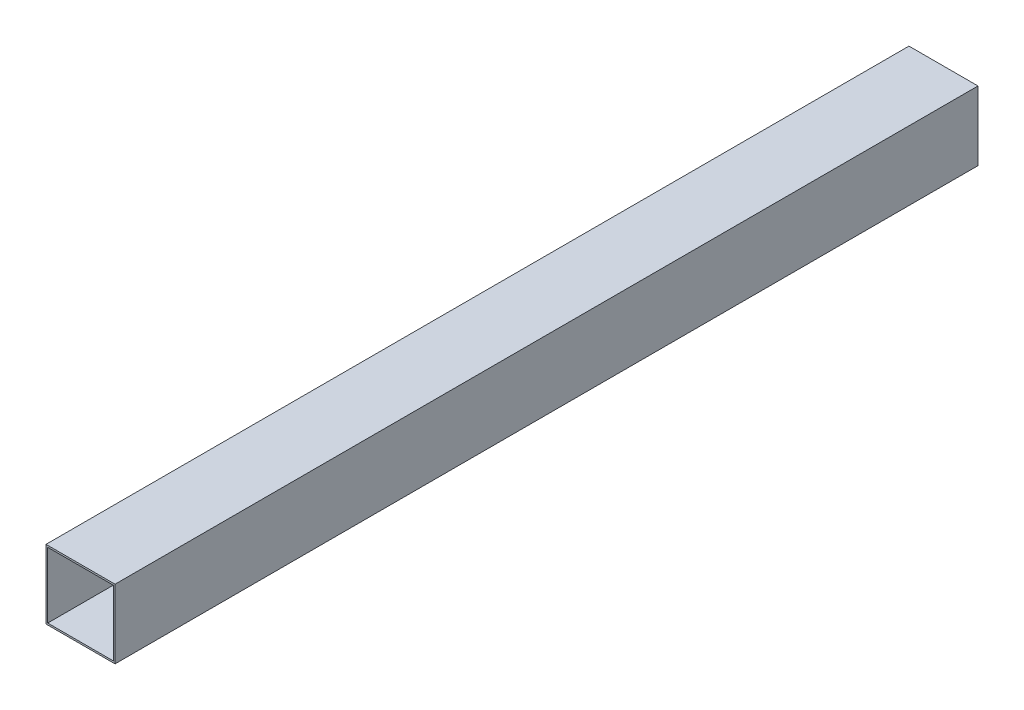
ISO-10303-21;
HEADER;
FILE_DESCRIPTION(('STEP AP214'),'2;1');
FILE_NAME('part.step','',(''),(''),'','','');
FILE_SCHEMA(('AUTOMOTIVE_DESIGN { 1 0 10303 214 1 1 1 1 }'));
ENDSEC;
DATA;
#1=APPLICATION_CONTEXT('core data for automotive mechanical design processes');
#2=APPLICATION_PROTOCOL_DEFINITION('international standard','automotive_design',2000,#1);
#3=PRODUCT_CONTEXT('',#1,'mechanical');
#4=PRODUCT('Part','Part','',(#3));
#5=PRODUCT_RELATED_PRODUCT_CATEGORY('part','',(#4));
#6=PRODUCT_DEFINITION_FORMATION('','',#4);
#7=PRODUCT_DEFINITION_CONTEXT('part definition',#1,'design');
#8=PRODUCT_DEFINITION('design','',#6,#7);
#9=PRODUCT_DEFINITION_SHAPE('','',#8);
#10=(LENGTH_UNIT() NAMED_UNIT(*) SI_UNIT(.MILLI.,.METRE.));
#11=(NAMED_UNIT(*) PLANE_ANGLE_UNIT() SI_UNIT($,.RADIAN.));
#12=(NAMED_UNIT(*) SI_UNIT($,.STERADIAN.) SOLID_ANGLE_UNIT());
#13=UNCERTAINTY_MEASURE_WITH_UNIT(LENGTH_MEASURE(1.E-05),#10,'distance_accuracy_value','');
#14=(GEOMETRIC_REPRESENTATION_CONTEXT(3) GLOBAL_UNCERTAINTY_ASSIGNED_CONTEXT((#13)) GLOBAL_UNIT_ASSIGNED_CONTEXT((#10,
#11,#12)) REPRESENTATION_CONTEXT('',''));
#15=CARTESIAN_POINT('',(0.,0.,0.));
#16=DIRECTION('',(0.,0.,1.));
#17=DIRECTION('',(1.,0.,0.));
#18=AXIS2_PLACEMENT_3D('',#15,#16,#17);
#19=CARTESIAN_POINT('',(0.,0.,500.));
#20=DIRECTION('',(0.,0.,1.));
#21=DIRECTION('',(1.,0.,0.));
#22=AXIS2_PLACEMENT_3D('',#19,#20,#21);
#23=PLANE('',#22);
#24=DIRECTION('',(0.,-1.,0.));
#25=VECTOR('',#24,1.);
#26=CARTESIAN_POINT('',(0.,29.5228896041213,500.));
#27=LINE('',#26,#25);
#28=CARTESIAN_POINT('',(0.,29.5228896041213,500.));
#29=VERTEX_POINT('',#28);
#30=CARTESIAN_POINT('',(0.,-10.4771103958787,500.));
#31=VERTEX_POINT('',#30);
#32=EDGE_CURVE('E142',#29,#31,#27,.T.);
#33=ORIENTED_EDGE('',*,*,#32,.T.);
#34=DIRECTION('',(1.,0.,0.));
#35=VECTOR('',#34,1.);
#36=CARTESIAN_POINT('',(0.,-10.4771103958787,500.));
#37=LINE('',#36,#35);
#38=CARTESIAN_POINT('',(40.,-10.4771103958787,500.));
#39=VERTEX_POINT('',#38);
#40=EDGE_CURVE('E145',#31,#39,#37,.T.);
#41=ORIENTED_EDGE('',*,*,#40,.T.);
#42=DIRECTION('',(0.,1.,0.));
#43=VECTOR('',#42,1.);
#44=CARTESIAN_POINT('',(40.,29.5228896041213,500.));
#45=LINE('',#44,#43);
#46=CARTESIAN_POINT('',(40.,29.5228896041213,500.));
#47=VERTEX_POINT('',#46);
#48=EDGE_CURVE('E148',#39,#47,#45,.T.);
#49=ORIENTED_EDGE('',*,*,#48,.T.);
#50=DIRECTION('',(-1.,0.,0.));
#51=VECTOR('',#50,1.);
#52=CARTESIAN_POINT('',(0.,29.5228896041213,500.));
#53=LINE('',#52,#51);
#54=EDGE_CURVE('E150',#47,#29,#53,.T.);
#55=ORIENTED_EDGE('',*,*,#54,.T.);
#56=EDGE_LOOP('',(#33,#41,#49,#55));
#57=FACE_BOUND('',#56,.T.);
#58=DIRECTION('',(1.,0.,0.));
#59=VECTOR('',#58,1.);
#60=CARTESIAN_POINT('',(1.,-9.4771103958787,500.));
#61=LINE('',#60,#59);
#62=CARTESIAN_POINT('',(1.,-9.4771103958787,500.));
#63=VERTEX_POINT('',#62);
#64=CARTESIAN_POINT('',(39.,-9.4771103958787,500.));
#65=VERTEX_POINT('',#64);
#66=EDGE_CURVE('E114',#63,#65,#61,.T.);
#67=ORIENTED_EDGE('',*,*,#66,.F.);
#68=DIRECTION('',(0.,-1.,0.));
#69=VECTOR('',#68,1.);
#70=CARTESIAN_POINT('',(0.999999999999997,28.5228896041213,500.));
#71=LINE('',#70,#69);
#72=CARTESIAN_POINT('',(0.999999999999997,28.5228896041213,500.));
#73=VERTEX_POINT('',#72);
#74=EDGE_CURVE('E106',#73,#63,#71,.T.);
#75=ORIENTED_EDGE('',*,*,#74,.F.);
#76=DIRECTION('',(-1.,0.,0.));
#77=VECTOR('',#76,1.);
#78=CARTESIAN_POINT('',(0.999999999999997,28.5228896041213,500.));
#79=LINE('',#78,#77);
#80=CARTESIAN_POINT('',(39.,28.5228896041213,500.));
#81=VERTEX_POINT('',#80);
#82=EDGE_CURVE('E128',#81,#73,#79,.T.);
#83=ORIENTED_EDGE('',*,*,#82,.F.);
#84=DIRECTION('',(0.,1.,0.));
#85=VECTOR('',#84,1.);
#86=CARTESIAN_POINT('',(39.,28.5228896041213,500.));
#87=LINE('',#86,#85);
#88=EDGE_CURVE('E126',#65,#81,#87,.T.);
#89=ORIENTED_EDGE('',*,*,#88,.F.);
#90=EDGE_LOOP('',(#67,#75,#83,#89));
#91=FACE_BOUND('',#90,.T.);
#92=ADVANCED_FACE('F41',(#57,#91),#23,.T.);
#93=CARTESIAN_POINT('',(0.,0.,0.));
#94=DIRECTION('',(0.,0.,1.));
#95=DIRECTION('',(1.,0.,0.));
#96=AXIS2_PLACEMENT_3D('',#93,#94,#95);
#97=PLANE('',#96);
#98=DIRECTION('',(0.,-1.,0.));
#99=VECTOR('',#98,1.);
#100=CARTESIAN_POINT('',(0.,29.5228896041213,0.));
#101=LINE('',#100,#99);
#102=CARTESIAN_POINT('',(0.,29.5228896041213,0.));
#103=VERTEX_POINT('',#102);
#104=CARTESIAN_POINT('',(0.,-10.4771103958787,0.));
#105=VERTEX_POINT('',#104);
#106=EDGE_CURVE('E122',#103,#105,#101,.T.);
#107=ORIENTED_EDGE('',*,*,#106,.F.);
#108=DIRECTION('',(-1.,0.,0.));
#109=VECTOR('',#108,1.);
#110=CARTESIAN_POINT('',(0.,29.5228896041213,0.));
#111=LINE('',#110,#109);
#112=CARTESIAN_POINT('',(40.,29.5228896041213,0.));
#113=VERTEX_POINT('',#112);
#114=EDGE_CURVE('E146',#113,#103,#111,.T.);
#115=ORIENTED_EDGE('',*,*,#114,.F.);
#116=DIRECTION('',(0.,1.,0.));
#117=VECTOR('',#116,1.);
#118=CARTESIAN_POINT('',(40.,29.5228896041213,0.));
#119=LINE('',#118,#117);
#120=CARTESIAN_POINT('',(40.,-10.4771103958787,0.));
#121=VERTEX_POINT('',#120);
#122=EDGE_CURVE('E157',#121,#113,#119,.T.);
#123=ORIENTED_EDGE('',*,*,#122,.F.);
#124=DIRECTION('',(1.,0.,0.));
#125=VECTOR('',#124,1.);
#126=CARTESIAN_POINT('',(0.,-10.4771103958787,0.));
#127=LINE('',#126,#125);
#128=EDGE_CURVE('E155',#105,#121,#127,.T.);
#129=ORIENTED_EDGE('',*,*,#128,.F.);
#130=EDGE_LOOP('',(#107,#115,#123,#129));
#131=FACE_BOUND('',#130,.T.);
#132=DIRECTION('',(0.,-1.,0.));
#133=VECTOR('',#132,1.);
#134=CARTESIAN_POINT('',(0.999999999999997,28.5228896041213,0.));
#135=LINE('',#134,#133);
#136=CARTESIAN_POINT('',(0.999999999999997,28.5228896041213,0.));
#137=VERTEX_POINT('',#136);
#138=CARTESIAN_POINT('',(1.,-9.4771103958787,0.));
#139=VERTEX_POINT('',#138);
#140=EDGE_CURVE('E64',#137,#139,#135,.T.);
#141=ORIENTED_EDGE('',*,*,#140,.T.);
#142=DIRECTION('',(1.,0.,0.));
#143=VECTOR('',#142,1.);
#144=CARTESIAN_POINT('',(1.,-9.4771103958787,0.));
#145=LINE('',#144,#143);
#146=CARTESIAN_POINT('',(39.,-9.4771103958787,0.));
#147=VERTEX_POINT('',#146);
#148=EDGE_CURVE('E121',#139,#147,#145,.T.);
#149=ORIENTED_EDGE('',*,*,#148,.T.);
#150=DIRECTION('',(0.,1.,0.));
#151=VECTOR('',#150,1.);
#152=CARTESIAN_POINT('',(39.,28.5228896041213,0.));
#153=LINE('',#152,#151);
#154=CARTESIAN_POINT('',(39.,28.5228896041213,0.));
#155=VERTEX_POINT('',#154);
#156=EDGE_CURVE('E134',#147,#155,#153,.T.);
#157=ORIENTED_EDGE('',*,*,#156,.T.);
#158=DIRECTION('',(-1.,0.,0.));
#159=VECTOR('',#158,1.);
#160=CARTESIAN_POINT('',(0.999999999999997,28.5228896041213,0.));
#161=LINE('',#160,#159);
#162=EDGE_CURVE('E115',#155,#137,#161,.T.);
#163=ORIENTED_EDGE('',*,*,#162,.T.);
#164=EDGE_LOOP('',(#141,#149,#157,#163));
#165=FACE_BOUND('',#164,.T.);
#166=ADVANCED_FACE('F175',(#131,#165),#97,.F.);
#167=CARTESIAN_POINT('',(0.,29.5228896041213,500.));
#168=DIRECTION('',(1.,0.,0.));
#169=DIRECTION('',(0.,1.,0.));
#170=AXIS2_PLACEMENT_3D('',#167,#168,#169);
#171=PLANE('',#170);
#172=ORIENTED_EDGE('',*,*,#106,.T.);
#173=DIRECTION('',(0.,0.,-1.));
#174=VECTOR('',#173,1.);
#175=CARTESIAN_POINT('',(0.,-10.4771103958787,500.));
#176=LINE('',#175,#174);
#177=EDGE_CURVE('E11',#31,#105,#176,.T.);
#178=ORIENTED_EDGE('',*,*,#177,.F.);
#179=ORIENTED_EDGE('',*,*,#32,.F.);
#180=DIRECTION('',(0.,0.,-1.));
#181=VECTOR('',#180,1.);
#182=CARTESIAN_POINT('',(0.,29.5228896041213,500.));
#183=LINE('',#182,#181);
#184=EDGE_CURVE('E152',#29,#103,#183,.T.);
#185=ORIENTED_EDGE('',*,*,#184,.T.);
#186=EDGE_LOOP('',(#172,#178,#179,#185));
#187=FACE_BOUND('',#186,.T.);
#188=ADVANCED_FACE('F43',(#187),#171,.F.);
#189=CARTESIAN_POINT('',(0.,-10.4771103958787,500.));
#190=DIRECTION('',(0.,1.,0.));
#191=DIRECTION('',(0.,0.,1.));
#192=AXIS2_PLACEMENT_3D('',#189,#190,#191);
#193=PLANE('',#192);
#194=ORIENTED_EDGE('',*,*,#128,.T.);
#195=DIRECTION('',(0.,0.,-1.));
#196=VECTOR('',#195,1.);
#197=CARTESIAN_POINT('',(40.,-10.4771103958787,500.));
#198=LINE('',#197,#196);
#199=EDGE_CURVE('E49',#39,#121,#198,.T.);
#200=ORIENTED_EDGE('',*,*,#199,.F.);
#201=ORIENTED_EDGE('',*,*,#40,.F.);
#202=ORIENTED_EDGE('',*,*,#177,.T.);
#203=EDGE_LOOP('',(#194,#200,#201,#202));
#204=FACE_BOUND('',#203,.T.);
#205=ADVANCED_FACE('F185',(#204),#193,.F.);
#206=CARTESIAN_POINT('',(40.,29.5228896041213,500.));
#207=DIRECTION('',(-1.,0.,0.));
#208=DIRECTION('',(0.,-1.,0.));
#209=AXIS2_PLACEMENT_3D('',#206,#207,#208);
#210=PLANE('',#209);
#211=ORIENTED_EDGE('',*,*,#122,.T.);
#212=DIRECTION('',(0.,0.,-1.));
#213=VECTOR('',#212,1.);
#214=CARTESIAN_POINT('',(40.,29.5228896041213,500.));
#215=LINE('',#214,#213);
#216=EDGE_CURVE('E162',#47,#113,#215,.T.);
#217=ORIENTED_EDGE('',*,*,#216,.F.);
#218=ORIENTED_EDGE('',*,*,#48,.F.);
#219=ORIENTED_EDGE('',*,*,#199,.T.);
#220=EDGE_LOOP('',(#211,#217,#218,#219));
#221=FACE_BOUND('',#220,.T.);
#222=ADVANCED_FACE('F169',(#221),#210,.F.);
#223=CARTESIAN_POINT('',(0.,29.5228896041213,500.));
#224=DIRECTION('',(0.,-1.,0.));
#225=DIRECTION('',(0.,0.,-1.));
#226=AXIS2_PLACEMENT_3D('',#223,#224,#225);
#227=PLANE('',#226);
#228=ORIENTED_EDGE('',*,*,#114,.T.);
#229=ORIENTED_EDGE('',*,*,#184,.F.);
#230=ORIENTED_EDGE('',*,*,#54,.F.);
#231=ORIENTED_EDGE('',*,*,#216,.T.);
#232=EDGE_LOOP('',(#228,#229,#230,#231));
#233=FACE_BOUND('',#232,.T.);
#234=ADVANCED_FACE('F179',(#233),#227,.F.);
#235=CARTESIAN_POINT('',(0.999999999999997,28.5228896041213,500.));
#236=DIRECTION('',(1.,0.,0.));
#237=DIRECTION('',(0.,1.,0.));
#238=AXIS2_PLACEMENT_3D('',#235,#236,#237);
#239=PLANE('',#238);
#240=ORIENTED_EDGE('',*,*,#140,.F.);
#241=DIRECTION('',(0.,0.,-1.));
#242=VECTOR('',#241,1.);
#243=CARTESIAN_POINT('',(0.999999999999997,28.5228896041213,500.));
#244=LINE('',#243,#242);
#245=EDGE_CURVE('E110',#73,#137,#244,.T.);
#246=ORIENTED_EDGE('',*,*,#245,.F.);
#247=ORIENTED_EDGE('',*,*,#74,.T.);
#248=DIRECTION('',(0.,0.,-1.));
#249=VECTOR('',#248,1.);
#250=CARTESIAN_POINT('',(1.,-9.4771103958787,500.));
#251=LINE('',#250,#249);
#252=EDGE_CURVE('E109',#63,#139,#251,.T.);
#253=ORIENTED_EDGE('',*,*,#252,.T.);
#254=EDGE_LOOP('',(#240,#246,#247,#253));
#255=FACE_BOUND('',#254,.T.);
#256=ADVANCED_FACE('F108',(#255),#239,.T.);
#257=CARTESIAN_POINT('',(1.,-9.4771103958787,500.));
#258=DIRECTION('',(0.,1.,0.));
#259=DIRECTION('',(0.,0.,1.));
#260=AXIS2_PLACEMENT_3D('',#257,#258,#259);
#261=PLANE('',#260);
#262=ORIENTED_EDGE('',*,*,#148,.F.);
#263=ORIENTED_EDGE('',*,*,#252,.F.);
#264=ORIENTED_EDGE('',*,*,#66,.T.);
#265=DIRECTION('',(0.,0.,-1.));
#266=VECTOR('',#265,1.);
#267=CARTESIAN_POINT('',(39.,-9.4771103958787,500.));
#268=LINE('',#267,#266);
#269=EDGE_CURVE('E123',#65,#147,#268,.T.);
#270=ORIENTED_EDGE('',*,*,#269,.T.);
#271=EDGE_LOOP('',(#262,#263,#264,#270));
#272=FACE_BOUND('',#271,.T.);
#273=ADVANCED_FACE('F118',(#272),#261,.T.);
#274=CARTESIAN_POINT('',(39.,28.5228896041213,500.));
#275=DIRECTION('',(-1.,0.,0.));
#276=DIRECTION('',(0.,-1.,0.));
#277=AXIS2_PLACEMENT_3D('',#274,#275,#276);
#278=PLANE('',#277);
#279=ORIENTED_EDGE('',*,*,#156,.F.);
#280=ORIENTED_EDGE('',*,*,#269,.F.);
#281=ORIENTED_EDGE('',*,*,#88,.T.);
#282=DIRECTION('',(0.,0.,-1.));
#283=VECTOR('',#282,1.);
#284=CARTESIAN_POINT('',(39.,28.5228896041213,500.));
#285=LINE('',#284,#283);
#286=EDGE_CURVE('E56',#81,#155,#285,.T.);
#287=ORIENTED_EDGE('',*,*,#286,.T.);
#288=EDGE_LOOP('',(#279,#280,#281,#287));
#289=FACE_BOUND('',#288,.T.);
#290=ADVANCED_FACE('F208',(#289),#278,.T.);
#291=CARTESIAN_POINT('',(0.999999999999997,28.5228896041213,500.));
#292=DIRECTION('',(0.,-1.,0.));
#293=DIRECTION('',(0.,0.,-1.));
#294=AXIS2_PLACEMENT_3D('',#291,#292,#293);
#295=PLANE('',#294);
#296=ORIENTED_EDGE('',*,*,#162,.F.);
#297=ORIENTED_EDGE('',*,*,#286,.F.);
#298=ORIENTED_EDGE('',*,*,#82,.T.);
#299=ORIENTED_EDGE('',*,*,#245,.T.);
#300=EDGE_LOOP('',(#296,#297,#298,#299));
#301=FACE_BOUND('',#300,.T.);
#302=ADVANCED_FACE('F212',(#301),#295,.T.);
#303=CLOSED_SHELL('',(#92,#166,#188,#205,#222,#234,#256,#273,#290,#302));
#304=MANIFOLD_SOLID_BREP('B2',#303);
#305=ADVANCED_BREP_SHAPE_REPRESENTATION('',(#18,#304),#14);
#306=SHAPE_DEFINITION_REPRESENTATION(#9,#305);
ENDSEC;
END-ISO-10303-21;
